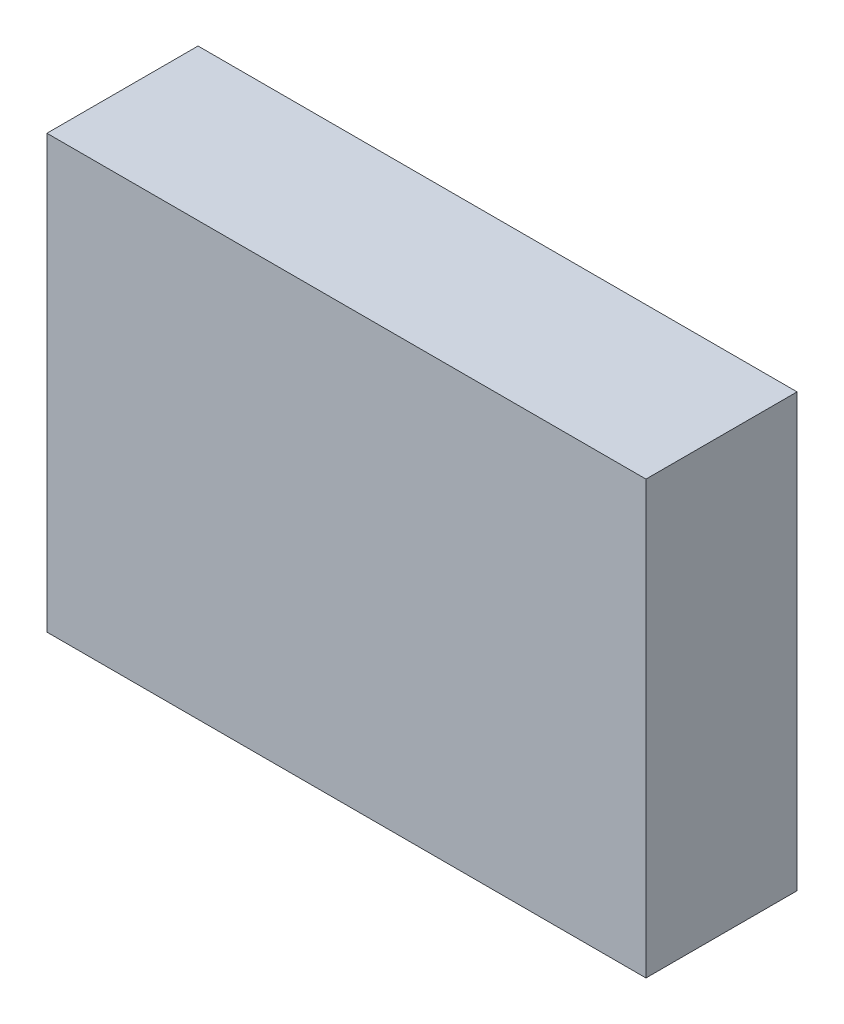
ISO-10303-21;
HEADER;
FILE_DESCRIPTION(('STEP AP214'),'2;1');
FILE_NAME('part.step','',(''),(''),'','','');
FILE_SCHEMA(('AUTOMOTIVE_DESIGN { 1 0 10303 214 1 1 1 1 }'));
ENDSEC;
DATA;
#1=APPLICATION_CONTEXT('core data for automotive mechanical design processes');
#2=APPLICATION_PROTOCOL_DEFINITION('international standard','automotive_design',2000,#1);
#3=PRODUCT_CONTEXT('',#1,'mechanical');
#4=PRODUCT('Part','Part','',(#3));
#5=PRODUCT_RELATED_PRODUCT_CATEGORY('part','',(#4));
#6=PRODUCT_DEFINITION_FORMATION('','',#4);
#7=PRODUCT_DEFINITION_CONTEXT('part definition',#1,'design');
#8=PRODUCT_DEFINITION('design','',#6,#7);
#9=PRODUCT_DEFINITION_SHAPE('','',#8);
#10=(LENGTH_UNIT() NAMED_UNIT(*) SI_UNIT(.MILLI.,.METRE.));
#11=(NAMED_UNIT(*) PLANE_ANGLE_UNIT() SI_UNIT($,.RADIAN.));
#12=(NAMED_UNIT(*) SI_UNIT($,.STERADIAN.) SOLID_ANGLE_UNIT());
#13=UNCERTAINTY_MEASURE_WITH_UNIT(LENGTH_MEASURE(1.E-05),#10,'distance_accuracy_value','');
#14=(GEOMETRIC_REPRESENTATION_CONTEXT(3) GLOBAL_UNCERTAINTY_ASSIGNED_CONTEXT((#13)) GLOBAL_UNIT_ASSIGNED_CONTEXT((#10,
#11,#12)) REPRESENTATION_CONTEXT('',''));
#15=CARTESIAN_POINT('',(0.,0.,0.));
#16=DIRECTION('',(0.,0.,1.));
#17=DIRECTION('',(1.,0.,0.));
#18=AXIS2_PLACEMENT_3D('',#15,#16,#17);
#19=CARTESIAN_POINT('',(19.8223428804151,14.2974605084583,5.));
#20=DIRECTION('',(-1.,0.,0.));
#21=DIRECTION('',(0.,0.,1.));
#22=AXIS2_PLACEMENT_3D('',#19,#20,#21);
#23=PLANE('',#22);
#24=DIRECTION('',(0.,1.,0.));
#25=VECTOR('',#24,1.);
#26=CARTESIAN_POINT('',(19.8223428804151,14.2974605084583,-5.));
#27=LINE('',#26,#25);
#28=CARTESIAN_POINT('',(19.8223428804151,-14.2974605084583,-5.));
#29=VERTEX_POINT('',#28);
#30=CARTESIAN_POINT('',(19.8223428804151,14.2974605084583,-5.));
#31=VERTEX_POINT('',#30);
#32=EDGE_CURVE('E98',#29,#31,#27,.T.);
#33=ORIENTED_EDGE('',*,*,#32,.T.);
#34=DIRECTION('',(0.,0.,-1.));
#35=VECTOR('',#34,1.);
#36=CARTESIAN_POINT('',(19.8223428804151,14.2974605084583,5.));
#37=LINE('',#36,#35);
#38=CARTESIAN_POINT('',(19.8223428804151,14.2974605084583,5.));
#39=VERTEX_POINT('',#38);
#40=EDGE_CURVE('E11',#39,#31,#37,.T.);
#41=ORIENTED_EDGE('',*,*,#40,.F.);
#42=DIRECTION('',(0.,1.,0.));
#43=VECTOR('',#42,1.);
#44=CARTESIAN_POINT('',(19.8223428804151,14.2974605084583,5.));
#45=LINE('',#44,#43);
#46=CARTESIAN_POINT('',(19.8223428804151,-14.2974605084583,5.));
#47=VERTEX_POINT('',#46);
#48=EDGE_CURVE('E86',#47,#39,#45,.T.);
#49=ORIENTED_EDGE('',*,*,#48,.F.);
#50=DIRECTION('',(0.,0.,-1.));
#51=VECTOR('',#50,1.);
#52=CARTESIAN_POINT('',(19.8223428804151,-14.2974605084583,5.));
#53=LINE('',#52,#51);
#54=EDGE_CURVE('E94',#47,#29,#53,.T.);
#55=ORIENTED_EDGE('',*,*,#54,.T.);
#56=EDGE_LOOP('',(#33,#41,#49,#55));
#57=FACE_BOUND('',#56,.T.);
#58=ADVANCED_FACE('F35',(#57),#23,.F.);
#59=CARTESIAN_POINT('',(-19.8223428804151,14.2974605084583,5.));
#60=DIRECTION('',(0.,-1.,0.));
#61=DIRECTION('',(0.,0.,-1.));
#62=AXIS2_PLACEMENT_3D('',#59,#60,#61);
#63=PLANE('',#62);
#64=DIRECTION('',(-1.,0.,0.));
#65=VECTOR('',#64,1.);
#66=CARTESIAN_POINT('',(-19.8223428804151,14.2974605084583,-5.));
#67=LINE('',#66,#65);
#68=CARTESIAN_POINT('',(-19.8223428804151,14.2974605084583,-5.));
#69=VERTEX_POINT('',#68);
#70=EDGE_CURVE('E90',#31,#69,#67,.T.);
#71=ORIENTED_EDGE('',*,*,#70,.T.);
#72=DIRECTION('',(0.,0.,-1.));
#73=VECTOR('',#72,1.);
#74=CARTESIAN_POINT('',(-19.8223428804151,14.2974605084583,5.));
#75=LINE('',#74,#73);
#76=CARTESIAN_POINT('',(-19.8223428804151,14.2974605084583,5.));
#77=VERTEX_POINT('',#76);
#78=EDGE_CURVE('E43',#77,#69,#75,.T.);
#79=ORIENTED_EDGE('',*,*,#78,.F.);
#80=DIRECTION('',(-1.,0.,0.));
#81=VECTOR('',#80,1.);
#82=CARTESIAN_POINT('',(-19.8223428804151,14.2974605084583,5.));
#83=LINE('',#82,#81);
#84=EDGE_CURVE('E81',#39,#77,#83,.T.);
#85=ORIENTED_EDGE('',*,*,#84,.F.);
#86=ORIENTED_EDGE('',*,*,#40,.T.);
#87=EDGE_LOOP('',(#71,#79,#85,#86));
#88=FACE_BOUND('',#87,.T.);
#89=ADVANCED_FACE('F89',(#88),#63,.F.);
#90=CARTESIAN_POINT('',(-19.8223428804151,14.2974605084583,5.));
#91=DIRECTION('',(1.,0.,0.));
#92=DIRECTION('',(0.,0.,-1.));
#93=AXIS2_PLACEMENT_3D('',#90,#91,#92);
#94=PLANE('',#93);
#95=DIRECTION('',(0.,-1.,0.));
#96=VECTOR('',#95,1.);
#97=CARTESIAN_POINT('',(-19.8223428804151,14.2974605084583,-5.));
#98=LINE('',#97,#96);
#99=CARTESIAN_POINT('',(-19.8223428804151,-14.2974605084583,-5.));
#100=VERTEX_POINT('',#99);
#101=EDGE_CURVE('E68',#69,#100,#98,.T.);
#102=ORIENTED_EDGE('',*,*,#101,.T.);
#103=DIRECTION('',(0.,0.,-1.));
#104=VECTOR('',#103,1.);
#105=CARTESIAN_POINT('',(-19.8223428804151,-14.2974605084583,5.));
#106=LINE('',#105,#104);
#107=CARTESIAN_POINT('',(-19.8223428804151,-14.2974605084583,5.));
#108=VERTEX_POINT('',#107);
#109=EDGE_CURVE('E91',#108,#100,#106,.T.);
#110=ORIENTED_EDGE('',*,*,#109,.F.);
#111=DIRECTION('',(0.,-1.,0.));
#112=VECTOR('',#111,1.);
#113=CARTESIAN_POINT('',(-19.8223428804151,14.2974605084583,5.));
#114=LINE('',#113,#112);
#115=EDGE_CURVE('E84',#77,#108,#114,.T.);
#116=ORIENTED_EDGE('',*,*,#115,.F.);
#117=ORIENTED_EDGE('',*,*,#78,.T.);
#118=EDGE_LOOP('',(#102,#110,#116,#117));
#119=FACE_BOUND('',#118,.T.);
#120=ADVANCED_FACE('F92',(#119),#94,.F.);
#121=CARTESIAN_POINT('',(-19.8223428804151,-14.2974605084583,5.));
#122=DIRECTION('',(0.,1.,0.));
#123=DIRECTION('',(0.,0.,1.));
#124=AXIS2_PLACEMENT_3D('',#121,#122,#123);
#125=PLANE('',#124);
#126=DIRECTION('',(1.,0.,0.));
#127=VECTOR('',#126,1.);
#128=CARTESIAN_POINT('',(-19.8223428804151,-14.2974605084583,-5.));
#129=LINE('',#128,#127);
#130=EDGE_CURVE('E74',#100,#29,#129,.T.);
#131=ORIENTED_EDGE('',*,*,#130,.T.);
#132=ORIENTED_EDGE('',*,*,#54,.F.);
#133=DIRECTION('',(1.,0.,0.));
#134=VECTOR('',#133,1.);
#135=CARTESIAN_POINT('',(-19.8223428804151,-14.2974605084583,5.));
#136=LINE('',#135,#134);
#137=EDGE_CURVE('E51',#108,#47,#136,.T.);
#138=ORIENTED_EDGE('',*,*,#137,.F.);
#139=ORIENTED_EDGE('',*,*,#109,.T.);
#140=EDGE_LOOP('',(#131,#132,#138,#139));
#141=FACE_BOUND('',#140,.T.);
#142=ADVANCED_FACE('F105',(#141),#125,.F.);
#143=CARTESIAN_POINT('',(0.,0.,5.));
#144=DIRECTION('',(0.,0.,1.));
#145=DIRECTION('',(1.,0.,0.));
#146=AXIS2_PLACEMENT_3D('',#143,#144,#145);
#147=PLANE('',#146);
#148=ORIENTED_EDGE('',*,*,#48,.T.);
#149=ORIENTED_EDGE('',*,*,#84,.T.);
#150=ORIENTED_EDGE('',*,*,#115,.T.);
#151=ORIENTED_EDGE('',*,*,#137,.T.);
#152=EDGE_LOOP('',(#148,#149,#150,#151));
#153=FACE_BOUND('',#152,.T.);
#154=ADVANCED_FACE('F82',(#153),#147,.T.);
#155=CARTESIAN_POINT('',(0.,0.,-5.));
#156=DIRECTION('',(0.,0.,1.));
#157=DIRECTION('',(1.,0.,0.));
#158=AXIS2_PLACEMENT_3D('',#155,#156,#157);
#159=PLANE('',#158);
#160=ORIENTED_EDGE('',*,*,#32,.F.);
#161=ORIENTED_EDGE('',*,*,#130,.F.);
#162=ORIENTED_EDGE('',*,*,#101,.F.);
#163=ORIENTED_EDGE('',*,*,#70,.F.);
#164=EDGE_LOOP('',(#160,#161,#162,#163));
#165=FACE_BOUND('',#164,.T.);
#166=ADVANCED_FACE('F108',(#165),#159,.F.);
#167=CLOSED_SHELL('',(#58,#89,#120,#142,#154,#166));
#168=MANIFOLD_SOLID_BREP('B2',#167);
#169=ADVANCED_BREP_SHAPE_REPRESENTATION('',(#18,#168),#14);
#170=SHAPE_DEFINITION_REPRESENTATION(#9,#169);
ENDSEC;
END-ISO-10303-21;
